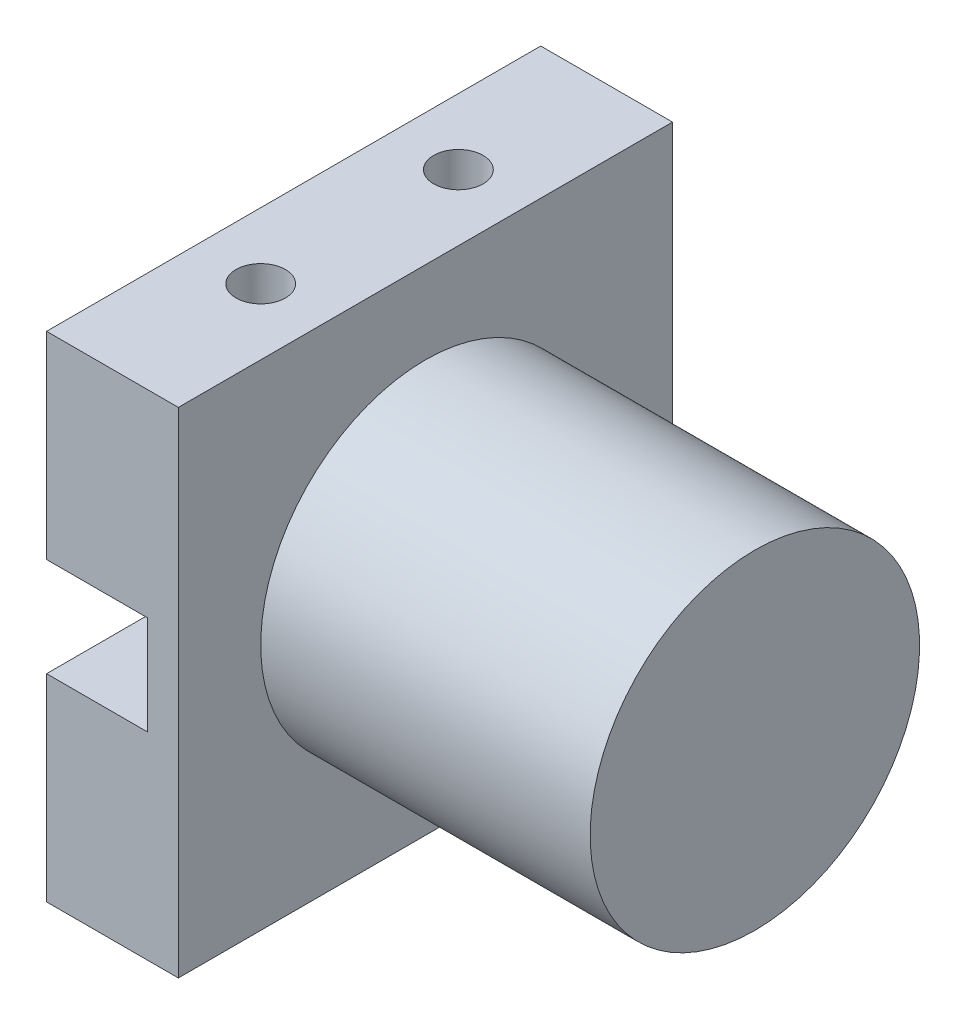
ISO-10303-21;
HEADER;
FILE_DESCRIPTION(('STEP AP214'),'2;1');
FILE_NAME('part.step','',(''),(''),'','','');
FILE_SCHEMA(('AUTOMOTIVE_DESIGN { 1 0 10303 214 1 1 1 1 }'));
ENDSEC;
DATA;
#1=APPLICATION_CONTEXT('core data for automotive mechanical design processes');
#2=APPLICATION_PROTOCOL_DEFINITION('international standard','automotive_design',2000,#1);
#3=PRODUCT_CONTEXT('',#1,'mechanical');
#4=PRODUCT('Part','Part','',(#3));
#5=PRODUCT_RELATED_PRODUCT_CATEGORY('part','',(#4));
#6=PRODUCT_DEFINITION_FORMATION('','',#4);
#7=PRODUCT_DEFINITION_CONTEXT('part definition',#1,'design');
#8=PRODUCT_DEFINITION('design','',#6,#7);
#9=PRODUCT_DEFINITION_SHAPE('','',#8);
#10=(LENGTH_UNIT() NAMED_UNIT(*) SI_UNIT(.MILLI.,.METRE.));
#11=(NAMED_UNIT(*) PLANE_ANGLE_UNIT() SI_UNIT($,.RADIAN.));
#12=(NAMED_UNIT(*) SI_UNIT($,.STERADIAN.) SOLID_ANGLE_UNIT());
#13=UNCERTAINTY_MEASURE_WITH_UNIT(LENGTH_MEASURE(1.E-05),#10,'distance_accuracy_value','');
#14=(GEOMETRIC_REPRESENTATION_CONTEXT(3) GLOBAL_UNCERTAINTY_ASSIGNED_CONTEXT((#13)) GLOBAL_UNIT_ASSIGNED_CONTEXT((#10,
#11,#12)) REPRESENTATION_CONTEXT('',''));
#15=CARTESIAN_POINT('',(0.,0.,0.));
#16=DIRECTION('',(0.,0.,1.));
#17=DIRECTION('',(1.,0.,0.));
#18=AXIS2_PLACEMENT_3D('',#15,#16,#17);
#19=CARTESIAN_POINT('',(-8.,-3.,15.));
#20=DIRECTION('',(1.,0.,0.));
#21=DIRECTION('',(0.,1.,0.));
#22=AXIS2_PLACEMENT_3D('',#19,#20,#21);
#23=PLANE('',#22);
#24=DIRECTION('',(0.,-1.,0.));
#25=VECTOR('',#24,1.);
#26=CARTESIAN_POINT('',(-8.,-3.,-15.));
#27=LINE('',#26,#25);
#28=CARTESIAN_POINT('',(-8.,-3.,-15.));
#29=VERTEX_POINT('',#28);
#30=CARTESIAN_POINT('',(-8.,-15.,-15.));
#31=VERTEX_POINT('',#30);
#32=EDGE_CURVE('E137',#29,#31,#27,.T.);
#33=ORIENTED_EDGE('',*,*,#32,.T.);
#34=DIRECTION('',(0.,0.,-1.));
#35=VECTOR('',#34,1.);
#36=CARTESIAN_POINT('',(-8.,-15.,15.));
#37=LINE('',#36,#35);
#38=CARTESIAN_POINT('',(-8.,-15.,15.));
#39=VERTEX_POINT('',#38);
#40=EDGE_CURVE('E47',#39,#31,#37,.T.);
#41=ORIENTED_EDGE('',*,*,#40,.F.);
#42=DIRECTION('',(0.,-1.,0.));
#43=VECTOR('',#42,1.);
#44=CARTESIAN_POINT('',(-8.,-3.,15.));
#45=LINE('',#44,#43);
#46=CARTESIAN_POINT('',(-8.,-3.,15.));
#47=VERTEX_POINT('',#46);
#48=EDGE_CURVE('E152',#47,#39,#45,.T.);
#49=ORIENTED_EDGE('',*,*,#48,.F.);
#50=DIRECTION('',(0.,0.,-1.));
#51=VECTOR('',#50,1.);
#52=CARTESIAN_POINT('',(-8.,-3.,15.));
#53=LINE('',#52,#51);
#54=EDGE_CURVE('E133',#47,#29,#53,.T.);
#55=ORIENTED_EDGE('',*,*,#54,.T.);
#56=EDGE_LOOP('',(#33,#41,#49,#55));
#57=FACE_BOUND('',#56,.T.);
#58=ADVANCED_FACE('F38',(#57),#23,.F.);
#59=CARTESIAN_POINT('',(-8.,-15.,15.));
#60=DIRECTION('',(0.,1.,0.));
#61=DIRECTION('',(0.,0.,1.));
#62=AXIS2_PLACEMENT_3D('',#59,#60,#61);
#63=PLANE('',#62);
#64=CARTESIAN_POINT('',(-4.00000000000001,-15.,-6.));
#65=DIRECTION('',(0.,1.,0.));
#66=DIRECTION('',(0.,0.,1.));
#67=AXIS2_PLACEMENT_3D('',#64,#65,#66);
#68=CIRCLE('',#67,1.5);
#69=CARTESIAN_POINT('',(-4.00000000000001,-15.,-4.5));
#70=VERTEX_POINT('',#69);
#71=EDGE_CURVE('E168',#70,#70,#68,.T.);
#72=ORIENTED_EDGE('',*,*,#71,.T.);
#73=EDGE_LOOP('',(#72));
#74=FACE_BOUND('',#73,.T.);
#75=CARTESIAN_POINT('',(-4.00000000000001,-15.,6.));
#76=DIRECTION('',(0.,1.,0.));
#77=DIRECTION('',(0.,0.,-1.));
#78=AXIS2_PLACEMENT_3D('',#75,#76,#77);
#79=CIRCLE('',#78,1.5);
#80=CARTESIAN_POINT('',(-4.00000000000001,-15.,4.5));
#81=VERTEX_POINT('',#80);
#82=EDGE_CURVE('E179',#81,#81,#79,.T.);
#83=ORIENTED_EDGE('',*,*,#82,.T.);
#84=EDGE_LOOP('',(#83));
#85=FACE_BOUND('',#84,.T.);
#86=DIRECTION('',(1.,0.,0.));
#87=VECTOR('',#86,1.);
#88=CARTESIAN_POINT('',(-8.,-15.,-15.));
#89=LINE('',#88,#87);
#90=CARTESIAN_POINT('',(0.,-15.,-15.));
#91=VERTEX_POINT('',#90);
#92=EDGE_CURVE('E140',#31,#91,#89,.T.);
#93=ORIENTED_EDGE('',*,*,#92,.T.);
#94=DIRECTION('',(0.,0.,-1.));
#95=VECTOR('',#94,1.);
#96=CARTESIAN_POINT('',(0.,-15.,15.));
#97=LINE('',#96,#95);
#98=CARTESIAN_POINT('',(0.,-15.,15.));
#99=VERTEX_POINT('',#98);
#100=EDGE_CURVE('E162',#99,#91,#97,.T.);
#101=ORIENTED_EDGE('',*,*,#100,.F.);
#102=DIRECTION('',(1.,0.,0.));
#103=VECTOR('',#102,1.);
#104=CARTESIAN_POINT('',(-8.,-15.,15.));
#105=LINE('',#104,#103);
#106=EDGE_CURVE('E100',#39,#99,#105,.T.);
#107=ORIENTED_EDGE('',*,*,#106,.F.);
#108=ORIENTED_EDGE('',*,*,#40,.T.);
#109=EDGE_LOOP('',(#93,#101,#107,#108));
#110=FACE_BOUND('',#109,.T.);
#111=ADVANCED_FACE('F226',(#74,#85,#110),#63,.F.);
#112=CARTESIAN_POINT('',(0.,-15.,15.));
#113=DIRECTION('',(-1.,0.,0.));
#114=DIRECTION('',(0.,-1.,0.));
#115=AXIS2_PLACEMENT_3D('',#112,#113,#114);
#116=PLANE('',#115);
#117=CARTESIAN_POINT('',(0.,0.,0.));
#118=DIRECTION('',(1.,0.,0.));
#119=DIRECTION('',(0.,1.,0.));
#120=AXIS2_PLACEMENT_3D('',#117,#118,#119);
#121=CIRCLE('',#120,10.);
#122=CARTESIAN_POINT('',(0.,10.,0.));
#123=VERTEX_POINT('',#122);
#124=EDGE_CURVE('E11',#123,#123,#121,.T.);
#125=ORIENTED_EDGE('',*,*,#124,.F.);
#126=EDGE_LOOP('',(#125));
#127=FACE_BOUND('',#126,.T.);
#128=DIRECTION('',(0.,1.,0.));
#129=VECTOR('',#128,1.);
#130=CARTESIAN_POINT('',(0.,-15.,-15.));
#131=LINE('',#130,#129);
#132=CARTESIAN_POINT('',(0.,15.,-15.));
#133=VERTEX_POINT('',#132);
#134=EDGE_CURVE('E143',#91,#133,#131,.T.);
#135=ORIENTED_EDGE('',*,*,#134,.T.);
#136=DIRECTION('',(0.,0.,-1.));
#137=VECTOR('',#136,1.);
#138=CARTESIAN_POINT('',(0.,15.,15.));
#139=LINE('',#138,#137);
#140=CARTESIAN_POINT('',(0.,15.,15.));
#141=VERTEX_POINT('',#140);
#142=EDGE_CURVE('E159',#141,#133,#139,.T.);
#143=ORIENTED_EDGE('',*,*,#142,.F.);
#144=DIRECTION('',(0.,1.,0.));
#145=VECTOR('',#144,1.);
#146=CARTESIAN_POINT('',(0.,-15.,15.));
#147=LINE('',#146,#145);
#148=EDGE_CURVE('E193',#99,#141,#147,.T.);
#149=ORIENTED_EDGE('',*,*,#148,.F.);
#150=ORIENTED_EDGE('',*,*,#100,.T.);
#151=EDGE_LOOP('',(#135,#143,#149,#150));
#152=FACE_BOUND('',#151,.T.);
#153=ADVANCED_FACE('F230',(#127,#152),#116,.F.);
#154=CARTESIAN_POINT('',(0.,15.,15.));
#155=DIRECTION('',(0.,-1.,0.));
#156=DIRECTION('',(1.,0.,0.));
#157=AXIS2_PLACEMENT_3D('',#154,#155,#156);
#158=PLANE('',#157);
#159=CARTESIAN_POINT('',(-4.00000000000001,15.,-6.));
#160=DIRECTION('',(0.,1.,0.));
#161=DIRECTION('',(0.,0.,1.));
#162=AXIS2_PLACEMENT_3D('',#159,#160,#161);
#163=CIRCLE('',#162,1.5);
#164=CARTESIAN_POINT('',(-4.00000000000001,15.,-4.5));
#165=VERTEX_POINT('',#164);
#166=EDGE_CURVE('E174',#165,#165,#163,.T.);
#167=ORIENTED_EDGE('',*,*,#166,.F.);
#168=EDGE_LOOP('',(#167));
#169=FACE_BOUND('',#168,.T.);
#170=CARTESIAN_POINT('',(-4.00000000000001,15.,6.));
#171=DIRECTION('',(0.,1.,0.));
#172=DIRECTION('',(0.,0.,-1.));
#173=AXIS2_PLACEMENT_3D('',#170,#171,#172);
#174=CIRCLE('',#173,1.5);
#175=CARTESIAN_POINT('',(-4.00000000000001,15.,4.5));
#176=VERTEX_POINT('',#175);
#177=EDGE_CURVE('E185',#176,#176,#174,.T.);
#178=ORIENTED_EDGE('',*,*,#177,.F.);
#179=EDGE_LOOP('',(#178));
#180=FACE_BOUND('',#179,.T.);
#181=DIRECTION('',(-1.,0.,0.));
#182=VECTOR('',#181,1.);
#183=CARTESIAN_POINT('',(0.,15.,-15.));
#184=LINE('',#183,#182);
#185=CARTESIAN_POINT('',(-8.00000000000001,15.,-15.));
#186=VERTEX_POINT('',#185);
#187=EDGE_CURVE('E145',#133,#186,#184,.T.);
#188=ORIENTED_EDGE('',*,*,#187,.T.);
#189=DIRECTION('',(0.,0.,-1.));
#190=VECTOR('',#189,1.);
#191=CARTESIAN_POINT('',(-8.00000000000001,15.,15.));
#192=LINE('',#191,#190);
#193=CARTESIAN_POINT('',(-8.00000000000001,15.,15.));
#194=VERTEX_POINT('',#193);
#195=EDGE_CURVE('E156',#194,#186,#192,.T.);
#196=ORIENTED_EDGE('',*,*,#195,.F.);
#197=DIRECTION('',(-1.,0.,0.));
#198=VECTOR('',#197,1.);
#199=CARTESIAN_POINT('',(0.,15.,15.));
#200=LINE('',#199,#198);
#201=EDGE_CURVE('E195',#141,#194,#200,.T.);
#202=ORIENTED_EDGE('',*,*,#201,.F.);
#203=ORIENTED_EDGE('',*,*,#142,.T.);
#204=EDGE_LOOP('',(#188,#196,#202,#203));
#205=FACE_BOUND('',#204,.T.);
#206=ADVANCED_FACE('F201',(#169,#180,#205),#158,.F.);
#207=CARTESIAN_POINT('',(-8.00000000000001,15.,15.));
#208=DIRECTION('',(1.,0.,0.));
#209=DIRECTION('',(0.,1.,0.));
#210=AXIS2_PLACEMENT_3D('',#207,#208,#209);
#211=PLANE('',#210);
#212=DIRECTION('',(0.,-1.,0.));
#213=VECTOR('',#212,1.);
#214=CARTESIAN_POINT('',(-8.00000000000001,15.,-15.));
#215=LINE('',#214,#213);
#216=CARTESIAN_POINT('',(-8.,3.,-15.));
#217=VERTEX_POINT('',#216);
#218=EDGE_CURVE('E147',#186,#217,#215,.T.);
#219=ORIENTED_EDGE('',*,*,#218,.T.);
#220=DIRECTION('',(0.,0.,-1.));
#221=VECTOR('',#220,1.);
#222=CARTESIAN_POINT('',(-8.,3.,15.));
#223=LINE('',#222,#221);
#224=CARTESIAN_POINT('',(-8.,3.,15.));
#225=VERTEX_POINT('',#224);
#226=EDGE_CURVE('E128',#225,#217,#223,.T.);
#227=ORIENTED_EDGE('',*,*,#226,.F.);
#228=DIRECTION('',(0.,-1.,0.));
#229=VECTOR('',#228,1.);
#230=CARTESIAN_POINT('',(-8.00000000000001,15.,15.));
#231=LINE('',#230,#229);
#232=EDGE_CURVE('E119',#194,#225,#231,.T.);
#233=ORIENTED_EDGE('',*,*,#232,.F.);
#234=ORIENTED_EDGE('',*,*,#195,.T.);
#235=EDGE_LOOP('',(#219,#227,#233,#234));
#236=FACE_BOUND('',#235,.T.);
#237=ADVANCED_FACE('F205',(#236),#211,.F.);
#238=CARTESIAN_POINT('',(-8.,3.,15.));
#239=DIRECTION('',(0.,1.,0.));
#240=DIRECTION('',(0.,0.,1.));
#241=AXIS2_PLACEMENT_3D('',#238,#239,#240);
#242=PLANE('',#241);
#243=CARTESIAN_POINT('',(-4.00000000000001,3.,-6.));
#244=DIRECTION('',(0.,1.,0.));
#245=DIRECTION('',(0.,0.,1.));
#246=AXIS2_PLACEMENT_3D('',#243,#244,#245);
#247=CIRCLE('',#246,1.5);
#248=CARTESIAN_POINT('',(-4.00000000000001,3.,-4.5));
#249=VERTEX_POINT('',#248);
#250=EDGE_CURVE('E141',#249,#249,#247,.T.);
#251=ORIENTED_EDGE('',*,*,#250,.T.);
#252=EDGE_LOOP('',(#251));
#253=FACE_BOUND('',#252,.T.);
#254=CARTESIAN_POINT('',(-4.00000000000001,3.,6.));
#255=DIRECTION('',(0.,1.,0.));
#256=DIRECTION('',(0.,0.,1.));
#257=AXIS2_PLACEMENT_3D('',#254,#255,#256);
#258=CIRCLE('',#257,1.5);
#259=CARTESIAN_POINT('',(-4.00000000000001,3.,7.5));
#260=VERTEX_POINT('',#259);
#261=EDGE_CURVE('E167',#260,#260,#258,.T.);
#262=ORIENTED_EDGE('',*,*,#261,.T.);
#263=EDGE_LOOP('',(#262));
#264=FACE_BOUND('',#263,.T.);
#265=DIRECTION('',(1.,0.,0.));
#266=VECTOR('',#265,1.);
#267=CARTESIAN_POINT('',(-8.,3.,-15.));
#268=LINE('',#267,#266);
#269=CARTESIAN_POINT('',(-1.88571428571429,3.,-15.));
#270=VERTEX_POINT('',#269);
#271=EDGE_CURVE('E127',#217,#270,#268,.T.);
#272=ORIENTED_EDGE('',*,*,#271,.T.);
#273=DIRECTION('',(0.,0.,-1.));
#274=VECTOR('',#273,1.);
#275=CARTESIAN_POINT('',(-1.88571428571429,3.,15.));
#276=LINE('',#275,#274);
#277=CARTESIAN_POINT('',(-1.88571428571429,3.,15.));
#278=VERTEX_POINT('',#277);
#279=EDGE_CURVE('E124',#278,#270,#276,.T.);
#280=ORIENTED_EDGE('',*,*,#279,.F.);
#281=DIRECTION('',(1.,0.,0.));
#282=VECTOR('',#281,1.);
#283=CARTESIAN_POINT('',(-8.,3.,15.));
#284=LINE('',#283,#282);
#285=EDGE_CURVE('E113',#225,#278,#284,.T.);
#286=ORIENTED_EDGE('',*,*,#285,.F.);
#287=ORIENTED_EDGE('',*,*,#226,.T.);
#288=EDGE_LOOP('',(#272,#280,#286,#287));
#289=FACE_BOUND('',#288,.T.);
#290=ADVANCED_FACE('F125',(#253,#264,#289),#242,.F.);
#291=CARTESIAN_POINT('',(-1.88571428571429,3.,15.));
#292=DIRECTION('',(1.,0.,0.));
#293=DIRECTION('',(0.,1.,0.));
#294=AXIS2_PLACEMENT_3D('',#291,#292,#293);
#295=PLANE('',#294);
#296=DIRECTION('',(0.,-1.,0.));
#297=VECTOR('',#296,1.);
#298=CARTESIAN_POINT('',(-1.88571428571429,3.,-15.));
#299=LINE('',#298,#297);
#300=CARTESIAN_POINT('',(-1.88571428571429,-3.,-15.));
#301=VERTEX_POINT('',#300);
#302=EDGE_CURVE('E85',#270,#301,#299,.T.);
#303=ORIENTED_EDGE('',*,*,#302,.T.);
#304=DIRECTION('',(0.,0.,-1.));
#305=VECTOR('',#304,1.);
#306=CARTESIAN_POINT('',(-1.88571428571429,-3.,15.));
#307=LINE('',#306,#305);
#308=CARTESIAN_POINT('',(-1.88571428571429,-3.,15.));
#309=VERTEX_POINT('',#308);
#310=EDGE_CURVE('E129',#309,#301,#307,.T.);
#311=ORIENTED_EDGE('',*,*,#310,.F.);
#312=DIRECTION('',(0.,-1.,0.));
#313=VECTOR('',#312,1.);
#314=CARTESIAN_POINT('',(-1.88571428571429,3.,15.));
#315=LINE('',#314,#313);
#316=EDGE_CURVE('E117',#278,#309,#315,.T.);
#317=ORIENTED_EDGE('',*,*,#316,.F.);
#318=ORIENTED_EDGE('',*,*,#279,.T.);
#319=EDGE_LOOP('',(#303,#311,#317,#318));
#320=FACE_BOUND('',#319,.T.);
#321=ADVANCED_FACE('F131',(#320),#295,.F.);
#322=CARTESIAN_POINT('',(-1.88571428571429,-3.,15.));
#323=DIRECTION('',(0.,-1.,0.));
#324=DIRECTION('',(1.,0.,0.));
#325=AXIS2_PLACEMENT_3D('',#322,#323,#324);
#326=PLANE('',#325);
#327=CARTESIAN_POINT('',(-4.00000000000001,-3.,-6.));
#328=DIRECTION('',(0.,-1.,0.));
#329=DIRECTION('',(1.,0.,0.));
#330=AXIS2_PLACEMENT_3D('',#327,#328,#329);
#331=CIRCLE('',#330,1.5);
#332=CARTESIAN_POINT('',(-2.50000000000001,-3.,-6.));
#333=VERTEX_POINT('',#332);
#334=EDGE_CURVE('E41',#333,#333,#331,.T.);
#335=ORIENTED_EDGE('',*,*,#334,.T.);
#336=EDGE_LOOP('',(#335));
#337=FACE_BOUND('',#336,.T.);
#338=CARTESIAN_POINT('',(-4.00000000000001,-3.,6.));
#339=DIRECTION('',(0.,-1.,0.));
#340=DIRECTION('',(1.,0.,0.));
#341=AXIS2_PLACEMENT_3D('',#338,#339,#340);
#342=CIRCLE('',#341,1.5);
#343=CARTESIAN_POINT('',(-2.50000000000001,-3.,6.));
#344=VERTEX_POINT('',#343);
#345=EDGE_CURVE('E165',#344,#344,#342,.T.);
#346=ORIENTED_EDGE('',*,*,#345,.T.);
#347=EDGE_LOOP('',(#346));
#348=FACE_BOUND('',#347,.T.);
#349=DIRECTION('',(-1.,0.,0.));
#350=VECTOR('',#349,1.);
#351=CARTESIAN_POINT('',(-1.88571428571429,-3.,-15.));
#352=LINE('',#351,#350);
#353=EDGE_CURVE('E91',#301,#29,#352,.T.);
#354=ORIENTED_EDGE('',*,*,#353,.T.);
#355=ORIENTED_EDGE('',*,*,#54,.F.);
#356=DIRECTION('',(-1.,0.,0.));
#357=VECTOR('',#356,1.);
#358=CARTESIAN_POINT('',(-1.88571428571429,-3.,15.));
#359=LINE('',#358,#357);
#360=EDGE_CURVE('E56',#309,#47,#359,.T.);
#361=ORIENTED_EDGE('',*,*,#360,.F.);
#362=ORIENTED_EDGE('',*,*,#310,.T.);
#363=EDGE_LOOP('',(#354,#355,#361,#362));
#364=FACE_BOUND('',#363,.T.);
#365=ADVANCED_FACE('F213',(#337,#348,#364),#326,.F.);
#366=CARTESIAN_POINT('',(0.,0.,15.));
#367=DIRECTION('',(0.,0.,1.));
#368=DIRECTION('',(1.,0.,0.));
#369=AXIS2_PLACEMENT_3D('',#366,#367,#368);
#370=PLANE('',#369);
#371=ORIENTED_EDGE('',*,*,#48,.T.);
#372=ORIENTED_EDGE('',*,*,#106,.T.);
#373=ORIENTED_EDGE('',*,*,#148,.T.);
#374=ORIENTED_EDGE('',*,*,#201,.T.);
#375=ORIENTED_EDGE('',*,*,#232,.T.);
#376=ORIENTED_EDGE('',*,*,#285,.T.);
#377=ORIENTED_EDGE('',*,*,#316,.T.);
#378=ORIENTED_EDGE('',*,*,#360,.T.);
#379=EDGE_LOOP('',(#371,#372,#373,#374,#375,#376,#377,#378));
#380=FACE_BOUND('',#379,.T.);
#381=ADVANCED_FACE('F115',(#380),#370,.T.);
#382=CARTESIAN_POINT('',(0.,0.,-15.));
#383=DIRECTION('',(0.,0.,1.));
#384=DIRECTION('',(1.,0.,0.));
#385=AXIS2_PLACEMENT_3D('',#382,#383,#384);
#386=PLANE('',#385);
#387=ORIENTED_EDGE('',*,*,#32,.F.);
#388=ORIENTED_EDGE('',*,*,#353,.F.);
#389=ORIENTED_EDGE('',*,*,#302,.F.);
#390=ORIENTED_EDGE('',*,*,#271,.F.);
#391=ORIENTED_EDGE('',*,*,#218,.F.);
#392=ORIENTED_EDGE('',*,*,#187,.F.);
#393=ORIENTED_EDGE('',*,*,#134,.F.);
#394=ORIENTED_EDGE('',*,*,#92,.F.);
#395=EDGE_LOOP('',(#387,#388,#389,#390,#391,#392,#393,#394));
#396=FACE_BOUND('',#395,.T.);
#397=ADVANCED_FACE('F208',(#396),#386,.F.);
#398=CARTESIAN_POINT('',(-4.00000000000001,-15.,6.));
#399=DIRECTION('',(0.,1.,0.));
#400=DIRECTION('',(0.,0.,1.));
#401=AXIS2_PLACEMENT_3D('',#398,#399,#400);
#402=CYLINDRICAL_SURFACE('',#401,1.5);
#403=ORIENTED_EDGE('',*,*,#82,.F.);
#404=EDGE_LOOP('',(#403));
#405=FACE_BOUND('',#404,.T.);
#406=ORIENTED_EDGE('',*,*,#345,.F.);
#407=EDGE_LOOP('',(#406));
#408=FACE_BOUND('',#407,.T.);
#409=ADVANCED_FACE('F257',(#405,#408),#402,.F.);
#410=CARTESIAN_POINT('',(-4.00000000000001,-15.,-6.));
#411=DIRECTION('',(0.,1.,0.));
#412=DIRECTION('',(0.,0.,1.));
#413=AXIS2_PLACEMENT_3D('',#410,#411,#412);
#414=CYLINDRICAL_SURFACE('',#413,1.5);
#415=ORIENTED_EDGE('',*,*,#71,.F.);
#416=EDGE_LOOP('',(#415));
#417=FACE_BOUND('',#416,.T.);
#418=ORIENTED_EDGE('',*,*,#334,.F.);
#419=EDGE_LOOP('',(#418));
#420=FACE_BOUND('',#419,.T.);
#421=ADVANCED_FACE('F254',(#417,#420),#414,.F.);
#422=ORIENTED_EDGE('',*,*,#177,.T.);
#423=EDGE_LOOP('',(#422));
#424=FACE_BOUND('',#423,.T.);
#425=ORIENTED_EDGE('',*,*,#261,.F.);
#426=EDGE_LOOP('',(#425));
#427=FACE_BOUND('',#426,.T.);
#428=ADVANCED_FACE('F251',(#424,#427),#402,.F.);
#429=ORIENTED_EDGE('',*,*,#166,.T.);
#430=EDGE_LOOP('',(#429));
#431=FACE_BOUND('',#430,.T.);
#432=ORIENTED_EDGE('',*,*,#250,.F.);
#433=EDGE_LOOP('',(#432));
#434=FACE_BOUND('',#433,.T.);
#435=ADVANCED_FACE('F253',(#431,#434),#414,.F.);
#436=CARTESIAN_POINT('',(20.,0.,0.));
#437=DIRECTION('',(-1.,0.,0.));
#438=DIRECTION('',(0.,-1.,0.));
#439=AXIS2_PLACEMENT_3D('',#436,#437,#438);
#440=CYLINDRICAL_SURFACE('',#439,10.);
#441=CARTESIAN_POINT('',(20.,0.,0.));
#442=DIRECTION('',(1.,0.,0.));
#443=DIRECTION('',(0.,1.,0.));
#444=AXIS2_PLACEMENT_3D('',#441,#442,#443);
#445=CIRCLE('',#444,10.);
#446=CARTESIAN_POINT('',(20.,10.,0.));
#447=VERTEX_POINT('',#446);
#448=EDGE_CURVE('E187',#447,#447,#445,.T.);
#449=ORIENTED_EDGE('',*,*,#448,.F.);
#450=EDGE_LOOP('',(#449));
#451=FACE_BOUND('',#450,.T.);
#452=ORIENTED_EDGE('',*,*,#124,.T.);
#453=EDGE_LOOP('',(#452));
#454=FACE_BOUND('',#453,.T.);
#455=ADVANCED_FACE('F262',(#451,#454),#440,.T.);
#456=CARTESIAN_POINT('',(20.,0.,0.));
#457=DIRECTION('',(1.,0.,0.));
#458=DIRECTION('',(0.,1.,0.));
#459=AXIS2_PLACEMENT_3D('',#456,#457,#458);
#460=PLANE('',#459);
#461=ORIENTED_EDGE('',*,*,#448,.T.);
#462=EDGE_LOOP('',(#461));
#463=FACE_BOUND('',#462,.T.);
#464=ADVANCED_FACE('F348',(#463),#460,.T.);
#465=CLOSED_SHELL('',(#58,#111,#153,#206,#237,#290,#321,#365,#381,#397,#409,#421,#428,#435,#455,#464));
#466=MANIFOLD_SOLID_BREP('B2',#465);
#467=ADVANCED_BREP_SHAPE_REPRESENTATION('',(#18,#466),#14);
#468=SHAPE_DEFINITION_REPRESENTATION(#9,#467);
ENDSEC;
END-ISO-10303-21;
